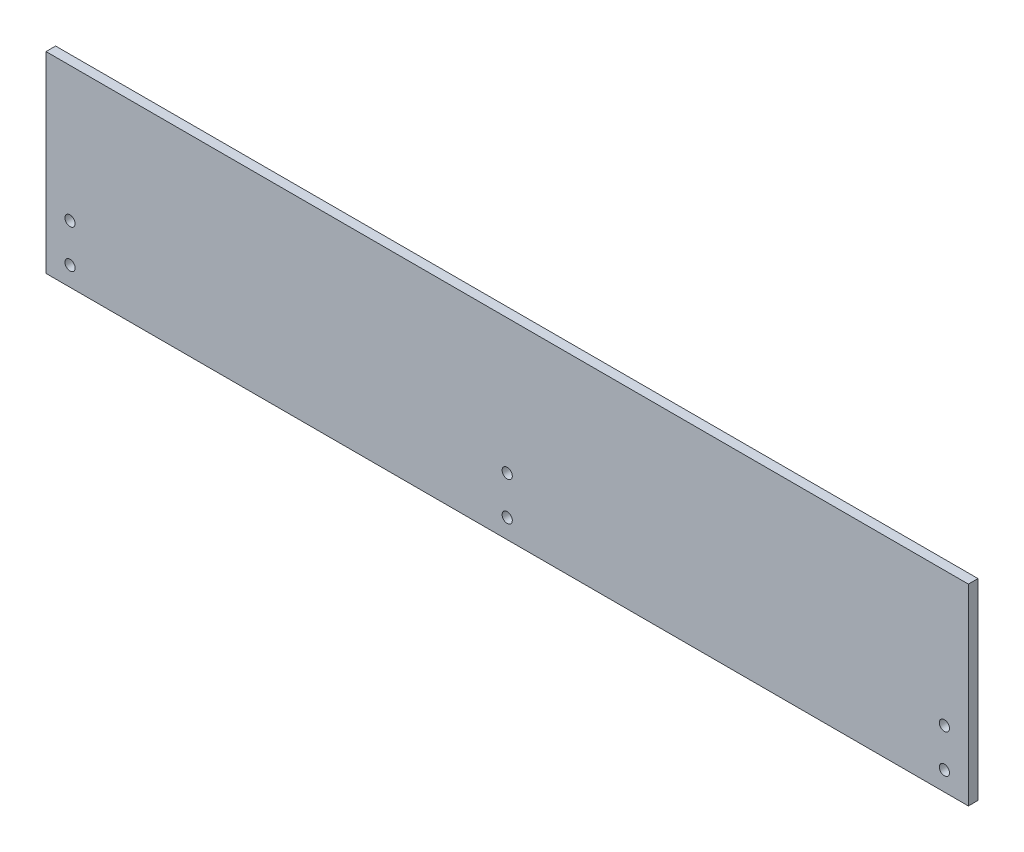
ISO-10303-21;
HEADER;
FILE_DESCRIPTION(('STEP AP214'),'2;1');
FILE_NAME('part.step','',(''),(''),'','','');
FILE_SCHEMA(('AUTOMOTIVE_DESIGN { 1 0 10303 214 1 1 1 1 }'));
ENDSEC;
DATA;
#1=APPLICATION_CONTEXT('core data for automotive mechanical design processes');
#2=APPLICATION_PROTOCOL_DEFINITION('international standard','automotive_design',2000,#1);
#3=PRODUCT_CONTEXT('',#1,'mechanical');
#4=PRODUCT('Part','Part','',(#3));
#5=PRODUCT_RELATED_PRODUCT_CATEGORY('part','',(#4));
#6=PRODUCT_DEFINITION_FORMATION('','',#4);
#7=PRODUCT_DEFINITION_CONTEXT('part definition',#1,'design');
#8=PRODUCT_DEFINITION('design','',#6,#7);
#9=PRODUCT_DEFINITION_SHAPE('','',#8);
#10=(LENGTH_UNIT() NAMED_UNIT(*) SI_UNIT(.MILLI.,.METRE.));
#11=(NAMED_UNIT(*) PLANE_ANGLE_UNIT() SI_UNIT($,.RADIAN.));
#12=(NAMED_UNIT(*) SI_UNIT($,.STERADIAN.) SOLID_ANGLE_UNIT());
#13=UNCERTAINTY_MEASURE_WITH_UNIT(LENGTH_MEASURE(1.E-05),#10,'distance_accuracy_value','');
#14=(GEOMETRIC_REPRESENTATION_CONTEXT(3) GLOBAL_UNCERTAINTY_ASSIGNED_CONTEXT((#13)) GLOBAL_UNIT_ASSIGNED_CONTEXT((#10,
#11,#12)) REPRESENTATION_CONTEXT('',''));
#15=CARTESIAN_POINT('',(0.,0.,0.));
#16=DIRECTION('',(0.,0.,1.));
#17=DIRECTION('',(1.,0.,0.));
#18=AXIS2_PLACEMENT_3D('',#15,#16,#17);
#19=CARTESIAN_POINT('',(0.,0.,6.35));
#20=DIRECTION('',(1.,0.,0.));
#21=DIRECTION('',(0.,1.,0.));
#22=AXIS2_PLACEMENT_3D('',#19,#20,#21);
#23=PLANE('',#22);
#24=DIRECTION('',(0.,-1.,0.));
#25=VECTOR('',#24,1.);
#26=CARTESIAN_POINT('',(0.,0.,0.));
#27=LINE('',#26,#25);
#28=CARTESIAN_POINT('',(-1.11022302462516E-13,127.,0.));
#29=VERTEX_POINT('',#28);
#30=CARTESIAN_POINT('',(0.,0.,0.));
#31=VERTEX_POINT('',#30);
#32=EDGE_CURVE('E114',#29,#31,#27,.T.);
#33=ORIENTED_EDGE('',*,*,#32,.T.);
#34=DIRECTION('',(0.,0.,-1.));
#35=VECTOR('',#34,1.);
#36=CARTESIAN_POINT('',(0.,0.,6.35));
#37=LINE('',#36,#35);
#38=CARTESIAN_POINT('',(0.,0.,6.35));
#39=VERTEX_POINT('',#38);
#40=EDGE_CURVE('E11',#39,#31,#37,.T.);
#41=ORIENTED_EDGE('',*,*,#40,.F.);
#42=DIRECTION('',(0.,-1.,0.));
#43=VECTOR('',#42,1.);
#44=CARTESIAN_POINT('',(0.,0.,6.35));
#45=LINE('',#44,#43);
#46=CARTESIAN_POINT('',(-1.11022302462516E-13,127.,6.35));
#47=VERTEX_POINT('',#46);
#48=EDGE_CURVE('E97',#47,#39,#45,.T.);
#49=ORIENTED_EDGE('',*,*,#48,.F.);
#50=DIRECTION('',(0.,0.,-1.));
#51=VECTOR('',#50,1.);
#52=CARTESIAN_POINT('',(-1.11022302462516E-13,127.,6.35));
#53=LINE('',#52,#51);
#54=EDGE_CURVE('E110',#47,#29,#53,.T.);
#55=ORIENTED_EDGE('',*,*,#54,.T.);
#56=EDGE_LOOP('',(#33,#41,#49,#55));
#57=FACE_BOUND('',#56,.T.);
#58=ADVANCED_FACE('F45',(#57),#23,.F.);
#59=CARTESIAN_POINT('',(0.,0.,6.35));
#60=DIRECTION('',(0.,1.,0.));
#61=DIRECTION('',(0.,0.,1.));
#62=AXIS2_PLACEMENT_3D('',#59,#60,#61);
#63=PLANE('',#62);
#64=DIRECTION('',(1.,0.,0.));
#65=VECTOR('',#64,1.);
#66=CARTESIAN_POINT('',(0.,0.,0.));
#67=LINE('',#66,#65);
#68=CARTESIAN_POINT('',(609.6,0.,0.));
#69=VERTEX_POINT('',#68);
#70=EDGE_CURVE('E102',#31,#69,#67,.T.);
#71=ORIENTED_EDGE('',*,*,#70,.T.);
#72=DIRECTION('',(0.,0.,-1.));
#73=VECTOR('',#72,1.);
#74=CARTESIAN_POINT('',(609.6,0.,6.35));
#75=LINE('',#74,#73);
#76=CARTESIAN_POINT('',(609.6,0.,6.35));
#77=VERTEX_POINT('',#76);
#78=EDGE_CURVE('E54',#77,#69,#75,.T.);
#79=ORIENTED_EDGE('',*,*,#78,.F.);
#80=DIRECTION('',(1.,0.,0.));
#81=VECTOR('',#80,1.);
#82=CARTESIAN_POINT('',(0.,0.,6.35));
#83=LINE('',#82,#81);
#84=EDGE_CURVE('E92',#39,#77,#83,.T.);
#85=ORIENTED_EDGE('',*,*,#84,.F.);
#86=ORIENTED_EDGE('',*,*,#40,.T.);
#87=EDGE_LOOP('',(#71,#79,#85,#86));
#88=FACE_BOUND('',#87,.T.);
#89=ADVANCED_FACE('F101',(#88),#63,.F.);
#90=CARTESIAN_POINT('',(609.6,0.,6.35));
#91=DIRECTION('',(-1.,0.,0.));
#92=DIRECTION('',(0.,-1.,0.));
#93=AXIS2_PLACEMENT_3D('',#90,#91,#92);
#94=PLANE('',#93);
#95=DIRECTION('',(0.,1.,0.));
#96=VECTOR('',#95,1.);
#97=CARTESIAN_POINT('',(609.6,0.,0.));
#98=LINE('',#97,#96);
#99=CARTESIAN_POINT('',(609.6,127.,0.));
#100=VERTEX_POINT('',#99);
#101=EDGE_CURVE('E79',#69,#100,#98,.T.);
#102=ORIENTED_EDGE('',*,*,#101,.T.);
#103=DIRECTION('',(0.,0.,-1.));
#104=VECTOR('',#103,1.);
#105=CARTESIAN_POINT('',(609.6,127.,6.35));
#106=LINE('',#105,#104);
#107=CARTESIAN_POINT('',(609.6,127.,6.35));
#108=VERTEX_POINT('',#107);
#109=EDGE_CURVE('E104',#108,#100,#106,.T.);
#110=ORIENTED_EDGE('',*,*,#109,.F.);
#111=DIRECTION('',(0.,1.,0.));
#112=VECTOR('',#111,1.);
#113=CARTESIAN_POINT('',(609.6,0.,6.35));
#114=LINE('',#113,#112);
#115=EDGE_CURVE('E95',#77,#108,#114,.T.);
#116=ORIENTED_EDGE('',*,*,#115,.F.);
#117=ORIENTED_EDGE('',*,*,#78,.T.);
#118=EDGE_LOOP('',(#102,#110,#116,#117));
#119=FACE_BOUND('',#118,.T.);
#120=ADVANCED_FACE('F105',(#119),#94,.F.);
#121=CARTESIAN_POINT('',(-1.11022302462516E-13,127.,6.35));
#122=DIRECTION('',(0.,-1.,0.));
#123=DIRECTION('',(0.,0.,-1.));
#124=AXIS2_PLACEMENT_3D('',#121,#122,#123);
#125=PLANE('',#124);
#126=DIRECTION('',(-1.,0.,0.));
#127=VECTOR('',#126,1.);
#128=CARTESIAN_POINT('',(-1.11022302462516E-13,127.,0.));
#129=LINE('',#128,#127);
#130=EDGE_CURVE('E85',#100,#29,#129,.T.);
#131=ORIENTED_EDGE('',*,*,#130,.T.);
#132=ORIENTED_EDGE('',*,*,#54,.F.);
#133=DIRECTION('',(-1.,0.,0.));
#134=VECTOR('',#133,1.);
#135=CARTESIAN_POINT('',(-1.11022302462516E-13,127.,6.35));
#136=LINE('',#135,#134);
#137=EDGE_CURVE('E62',#108,#47,#136,.T.);
#138=ORIENTED_EDGE('',*,*,#137,.F.);
#139=ORIENTED_EDGE('',*,*,#109,.T.);
#140=EDGE_LOOP('',(#131,#132,#138,#139));
#141=FACE_BOUND('',#140,.T.);
#142=ADVANCED_FACE('F129',(#141),#125,.F.);
#143=CARTESIAN_POINT('',(0.,0.,6.35));
#144=DIRECTION('',(0.,0.,-1.));
#145=DIRECTION('',(-1.,0.,0.));
#146=AXIS2_PLACEMENT_3D('',#143,#144,#145);
#147=PLANE('',#146);
#148=CARTESIAN_POINT('',(304.8,38.1,6.35));
#149=DIRECTION('',(0.,0.,1.));
#150=DIRECTION('',(1.,0.,0.));
#151=AXIS2_PLACEMENT_3D('',#148,#149,#150);
#152=CIRCLE('',#151,3.36550000000002);
#153=CARTESIAN_POINT('',(308.1655,38.1,6.35));
#154=VERTEX_POINT('',#153);
#155=EDGE_CURVE('E177',#154,#154,#152,.T.);
#156=ORIENTED_EDGE('',*,*,#155,.F.);
#157=EDGE_LOOP('',(#156));
#158=FACE_BOUND('',#157,.T.);
#159=CARTESIAN_POINT('',(304.8,12.7,6.35));
#160=DIRECTION('',(0.,0.,1.));
#161=DIRECTION('',(1.,0.,0.));
#162=AXIS2_PLACEMENT_3D('',#159,#160,#161);
#163=CIRCLE('',#162,3.36550000000002);
#164=CARTESIAN_POINT('',(308.1655,12.7,6.35));
#165=VERTEX_POINT('',#164);
#166=EDGE_CURVE('E173',#165,#165,#163,.T.);
#167=ORIENTED_EDGE('',*,*,#166,.F.);
#168=EDGE_LOOP('',(#167));
#169=FACE_BOUND('',#168,.T.);
#170=CARTESIAN_POINT('',(15.8749999999999,38.1,6.35));
#171=DIRECTION('',(0.,0.,1.));
#172=DIRECTION('',(1.,0.,0.));
#173=AXIS2_PLACEMENT_3D('',#170,#171,#172);
#174=CIRCLE('',#173,3.3655);
#175=CARTESIAN_POINT('',(19.2404999999999,38.1,6.35));
#176=VERTEX_POINT('',#175);
#177=EDGE_CURVE('E145',#176,#176,#174,.T.);
#178=ORIENTED_EDGE('',*,*,#177,.F.);
#179=EDGE_LOOP('',(#178));
#180=FACE_BOUND('',#179,.T.);
#181=CARTESIAN_POINT('',(593.725,38.1,6.35));
#182=DIRECTION('',(0.,0.,1.));
#183=DIRECTION('',(1.,0.,0.));
#184=AXIS2_PLACEMENT_3D('',#181,#182,#183);
#185=CIRCLE('',#184,3.36550000000002);
#186=CARTESIAN_POINT('',(597.0905,38.1,6.35));
#187=VERTEX_POINT('',#186);
#188=EDGE_CURVE('E154',#187,#187,#185,.T.);
#189=ORIENTED_EDGE('',*,*,#188,.F.);
#190=EDGE_LOOP('',(#189));
#191=FACE_BOUND('',#190,.T.);
#192=CARTESIAN_POINT('',(593.725,12.7,6.35));
#193=DIRECTION('',(0.,0.,1.));
#194=DIRECTION('',(1.,0.,0.));
#195=AXIS2_PLACEMENT_3D('',#192,#193,#194);
#196=CIRCLE('',#195,3.36550000000002);
#197=CARTESIAN_POINT('',(597.0905,12.7,6.35));
#198=VERTEX_POINT('',#197);
#199=EDGE_CURVE('E162',#198,#198,#196,.T.);
#200=ORIENTED_EDGE('',*,*,#199,.F.);
#201=EDGE_LOOP('',(#200));
#202=FACE_BOUND('',#201,.T.);
#203=CARTESIAN_POINT('',(15.8749999999999,12.7,6.35));
#204=DIRECTION('',(0.,0.,1.));
#205=DIRECTION('',(1.,0.,0.));
#206=AXIS2_PLACEMENT_3D('',#203,#204,#205);
#207=CIRCLE('',#206,3.3655);
#208=CARTESIAN_POINT('',(19.2404999999999,12.7,6.35));
#209=VERTEX_POINT('',#208);
#210=EDGE_CURVE('E137',#209,#209,#207,.T.);
#211=ORIENTED_EDGE('',*,*,#210,.F.);
#212=EDGE_LOOP('',(#211));
#213=FACE_BOUND('',#212,.T.);
#214=ORIENTED_EDGE('',*,*,#48,.T.);
#215=ORIENTED_EDGE('',*,*,#84,.T.);
#216=ORIENTED_EDGE('',*,*,#115,.T.);
#217=ORIENTED_EDGE('',*,*,#137,.T.);
#218=EDGE_LOOP('',(#214,#215,#216,#217));
#219=FACE_BOUND('',#218,.T.);
#220=ADVANCED_FACE('F93',(#158,#169,#180,#191,#202,#213,#219),#147,.F.);
#221=CARTESIAN_POINT('',(0.,0.,0.));
#222=DIRECTION('',(0.,0.,-1.));
#223=DIRECTION('',(-1.,0.,0.));
#224=AXIS2_PLACEMENT_3D('',#221,#222,#223);
#225=PLANE('',#224);
#226=CARTESIAN_POINT('',(304.8,38.1,0.));
#227=DIRECTION('',(0.,0.,1.));
#228=DIRECTION('',(1.,0.,0.));
#229=AXIS2_PLACEMENT_3D('',#226,#227,#228);
#230=CIRCLE('',#229,3.36550000000002);
#231=CARTESIAN_POINT('',(308.1655,38.1,0.));
#232=VERTEX_POINT('',#231);
#233=EDGE_CURVE('E150',#232,#232,#230,.T.);
#234=ORIENTED_EDGE('',*,*,#233,.T.);
#235=EDGE_LOOP('',(#234));
#236=FACE_BOUND('',#235,.T.);
#237=CARTESIAN_POINT('',(304.8,12.7,0.));
#238=DIRECTION('',(0.,0.,1.));
#239=DIRECTION('',(1.,0.,0.));
#240=AXIS2_PLACEMENT_3D('',#237,#238,#239);
#241=CIRCLE('',#240,3.36550000000002);
#242=CARTESIAN_POINT('',(308.1655,12.7,0.));
#243=VERTEX_POINT('',#242);
#244=EDGE_CURVE('E169',#243,#243,#241,.T.);
#245=ORIENTED_EDGE('',*,*,#244,.T.);
#246=EDGE_LOOP('',(#245));
#247=FACE_BOUND('',#246,.T.);
#248=CARTESIAN_POINT('',(15.8749999999999,38.1,0.));
#249=DIRECTION('',(0.,0.,1.));
#250=DIRECTION('',(1.,0.,0.));
#251=AXIS2_PLACEMENT_3D('',#248,#249,#250);
#252=CIRCLE('',#251,3.3655);
#253=CARTESIAN_POINT('',(19.2404999999999,38.1,0.));
#254=VERTEX_POINT('',#253);
#255=EDGE_CURVE('E149',#254,#254,#252,.T.);
#256=ORIENTED_EDGE('',*,*,#255,.T.);
#257=EDGE_LOOP('',(#256));
#258=FACE_BOUND('',#257,.T.);
#259=CARTESIAN_POINT('',(593.725,38.1,0.));
#260=DIRECTION('',(0.,0.,1.));
#261=DIRECTION('',(1.,0.,0.));
#262=AXIS2_PLACEMENT_3D('',#259,#260,#261);
#263=CIRCLE('',#262,3.36550000000002);
#264=CARTESIAN_POINT('',(597.0905,38.1,0.));
#265=VERTEX_POINT('',#264);
#266=EDGE_CURVE('E158',#265,#265,#263,.T.);
#267=ORIENTED_EDGE('',*,*,#266,.T.);
#268=EDGE_LOOP('',(#267));
#269=FACE_BOUND('',#268,.T.);
#270=CARTESIAN_POINT('',(593.725,12.7,0.));
#271=DIRECTION('',(0.,0.,1.));
#272=DIRECTION('',(1.,0.,0.));
#273=AXIS2_PLACEMENT_3D('',#270,#271,#272);
#274=CIRCLE('',#273,3.36550000000002);
#275=CARTESIAN_POINT('',(597.0905,12.7,0.));
#276=VERTEX_POINT('',#275);
#277=EDGE_CURVE('E141',#276,#276,#274,.T.);
#278=ORIENTED_EDGE('',*,*,#277,.T.);
#279=EDGE_LOOP('',(#278));
#280=FACE_BOUND('',#279,.T.);
#281=CARTESIAN_POINT('',(15.8749999999999,12.7,0.));
#282=DIRECTION('',(0.,0.,1.));
#283=DIRECTION('',(1.,0.,0.));
#284=AXIS2_PLACEMENT_3D('',#281,#282,#283);
#285=CIRCLE('',#284,3.3655);
#286=CARTESIAN_POINT('',(19.2404999999999,12.7,0.));
#287=VERTEX_POINT('',#286);
#288=EDGE_CURVE('E118',#287,#287,#285,.T.);
#289=ORIENTED_EDGE('',*,*,#288,.T.);
#290=EDGE_LOOP('',(#289));
#291=FACE_BOUND('',#290,.T.);
#292=ORIENTED_EDGE('',*,*,#32,.F.);
#293=ORIENTED_EDGE('',*,*,#130,.F.);
#294=ORIENTED_EDGE('',*,*,#101,.F.);
#295=ORIENTED_EDGE('',*,*,#70,.F.);
#296=EDGE_LOOP('',(#292,#293,#294,#295));
#297=FACE_BOUND('',#296,.T.);
#298=ADVANCED_FACE('F132',(#236,#247,#258,#269,#280,#291,#297),#225,.T.);
#299=CARTESIAN_POINT('',(15.8749999999999,12.7,0.));
#300=DIRECTION('',(0.,0.,1.));
#301=DIRECTION('',(1.,0.,0.));
#302=AXIS2_PLACEMENT_3D('',#299,#300,#301);
#303=CYLINDRICAL_SURFACE('',#302,3.3655);
#304=ORIENTED_EDGE('',*,*,#288,.F.);
#305=EDGE_LOOP('',(#304));
#306=FACE_BOUND('',#305,.T.);
#307=ORIENTED_EDGE('',*,*,#210,.T.);
#308=EDGE_LOOP('',(#307));
#309=FACE_BOUND('',#308,.T.);
#310=ADVANCED_FACE('F208',(#306,#309),#303,.F.);
#311=CARTESIAN_POINT('',(593.725,12.7,0.));
#312=DIRECTION('',(0.,0.,1.));
#313=DIRECTION('',(1.,0.,0.));
#314=AXIS2_PLACEMENT_3D('',#311,#312,#313);
#315=CYLINDRICAL_SURFACE('',#314,3.36550000000002);
#316=ORIENTED_EDGE('',*,*,#277,.F.);
#317=EDGE_LOOP('',(#316));
#318=FACE_BOUND('',#317,.T.);
#319=ORIENTED_EDGE('',*,*,#199,.T.);
#320=EDGE_LOOP('',(#319));
#321=FACE_BOUND('',#320,.T.);
#322=ADVANCED_FACE('F210',(#318,#321),#315,.F.);
#323=CARTESIAN_POINT('',(593.725,38.1,0.));
#324=DIRECTION('',(0.,0.,1.));
#325=DIRECTION('',(1.,0.,0.));
#326=AXIS2_PLACEMENT_3D('',#323,#324,#325);
#327=CYLINDRICAL_SURFACE('',#326,3.36550000000002);
#328=ORIENTED_EDGE('',*,*,#266,.F.);
#329=EDGE_LOOP('',(#328));
#330=FACE_BOUND('',#329,.T.);
#331=ORIENTED_EDGE('',*,*,#188,.T.);
#332=EDGE_LOOP('',(#331));
#333=FACE_BOUND('',#332,.T.);
#334=ADVANCED_FACE('F217',(#330,#333),#327,.F.);
#335=CARTESIAN_POINT('',(15.8749999999999,38.1,0.));
#336=DIRECTION('',(0.,0.,1.));
#337=DIRECTION('',(1.,0.,0.));
#338=AXIS2_PLACEMENT_3D('',#335,#336,#337);
#339=CYLINDRICAL_SURFACE('',#338,3.3655);
#340=ORIENTED_EDGE('',*,*,#255,.F.);
#341=EDGE_LOOP('',(#340));
#342=FACE_BOUND('',#341,.T.);
#343=ORIENTED_EDGE('',*,*,#177,.T.);
#344=EDGE_LOOP('',(#343));
#345=FACE_BOUND('',#344,.T.);
#346=ADVANCED_FACE('F277',(#342,#345),#339,.F.);
#347=CARTESIAN_POINT('',(304.8,12.7,0.));
#348=DIRECTION('',(0.,0.,1.));
#349=DIRECTION('',(1.,0.,0.));
#350=AXIS2_PLACEMENT_3D('',#347,#348,#349);
#351=CYLINDRICAL_SURFACE('',#350,3.36550000000002);
#352=ORIENTED_EDGE('',*,*,#244,.F.);
#353=EDGE_LOOP('',(#352));
#354=FACE_BOUND('',#353,.T.);
#355=ORIENTED_EDGE('',*,*,#166,.T.);
#356=EDGE_LOOP('',(#355));
#357=FACE_BOUND('',#356,.T.);
#358=ADVANCED_FACE('F191',(#354,#357),#351,.F.);
#359=CARTESIAN_POINT('',(304.8,38.1,0.));
#360=DIRECTION('',(0.,0.,1.));
#361=DIRECTION('',(1.,0.,0.));
#362=AXIS2_PLACEMENT_3D('',#359,#360,#361);
#363=CYLINDRICAL_SURFACE('',#362,3.36550000000002);
#364=ORIENTED_EDGE('',*,*,#233,.F.);
#365=EDGE_LOOP('',(#364));
#366=FACE_BOUND('',#365,.T.);
#367=ORIENTED_EDGE('',*,*,#155,.T.);
#368=EDGE_LOOP('',(#367));
#369=FACE_BOUND('',#368,.T.);
#370=ADVANCED_FACE('F188',(#366,#369),#363,.F.);
#371=CLOSED_SHELL('',(#58,#89,#120,#142,#220,#298,#310,#322,#334,#346,#358,#370));
#372=MANIFOLD_SOLID_BREP('B2',#371);
#373=ADVANCED_BREP_SHAPE_REPRESENTATION('',(#18,#372),#14);
#374=SHAPE_DEFINITION_REPRESENTATION(#9,#373);
ENDSEC;
END-ISO-10303-21;
